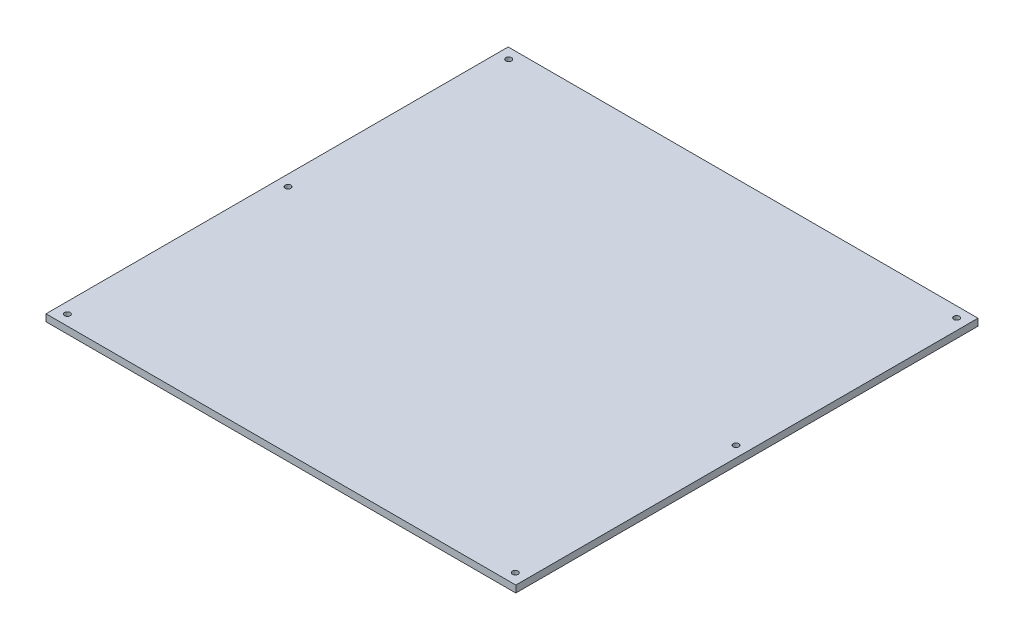
ISO-10303-21;
HEADER;
FILE_DESCRIPTION(('STEP AP214'),'2;1');
FILE_NAME('part.step','',(''),(''),'','','');
FILE_SCHEMA(('AUTOMOTIVE_DESIGN { 1 0 10303 214 1 1 1 1 }'));
ENDSEC;
DATA;
#1=APPLICATION_CONTEXT('core data for automotive mechanical design processes');
#2=APPLICATION_PROTOCOL_DEFINITION('international standard','automotive_design',2000,#1);
#3=PRODUCT_CONTEXT('',#1,'mechanical');
#4=PRODUCT('Part','Part','',(#3));
#5=PRODUCT_RELATED_PRODUCT_CATEGORY('part','',(#4));
#6=PRODUCT_DEFINITION_FORMATION('','',#4);
#7=PRODUCT_DEFINITION_CONTEXT('part definition',#1,'design');
#8=PRODUCT_DEFINITION('design','',#6,#7);
#9=PRODUCT_DEFINITION_SHAPE('','',#8);
#10=(LENGTH_UNIT() NAMED_UNIT(*) SI_UNIT(.MILLI.,.METRE.));
#11=(NAMED_UNIT(*) PLANE_ANGLE_UNIT() SI_UNIT($,.RADIAN.));
#12=(NAMED_UNIT(*) SI_UNIT($,.STERADIAN.) SOLID_ANGLE_UNIT());
#13=UNCERTAINTY_MEASURE_WITH_UNIT(LENGTH_MEASURE(1.E-05),#10,'distance_accuracy_value','');
#14=(GEOMETRIC_REPRESENTATION_CONTEXT(3) GLOBAL_UNCERTAINTY_ASSIGNED_CONTEXT((#13)) GLOBAL_UNIT_ASSIGNED_CONTEXT((#10,
#11,#12)) REPRESENTATION_CONTEXT('',''));
#15=CARTESIAN_POINT('',(0.,0.,0.));
#16=DIRECTION('',(0.,0.,1.));
#17=DIRECTION('',(1.,0.,0.));
#18=AXIS2_PLACEMENT_3D('',#15,#16,#17);
#19=CARTESIAN_POINT('',(0.,3.175,0.));
#20=DIRECTION('',(0.,-1.,0.));
#21=DIRECTION('',(0.,0.,-1.));
#22=AXIS2_PLACEMENT_3D('',#19,#20,#21);
#23=PLANE('',#22);
#24=CARTESIAN_POINT('',(-204.63,3.175,0.));
#25=DIRECTION('',(0.,1.,0.));
#26=DIRECTION('',(0.,0.,1.));
#27=AXIS2_PLACEMENT_3D('',#24,#25,#26);
#28=CIRCLE('',#27,2.59999999999999);
#29=CARTESIAN_POINT('',(-204.63,3.175,2.59999999999999));
#30=VERTEX_POINT('',#29);
#31=EDGE_CURVE('E132',#30,#30,#28,.T.);
#32=ORIENTED_EDGE('',*,*,#31,.F.);
#33=EDGE_LOOP('',(#32));
#34=FACE_BOUND('',#33,.T.);
#35=CARTESIAN_POINT('',(204.63,3.175,201.6125));
#36=DIRECTION('',(0.,1.,0.));
#37=DIRECTION('',(0.,0.,1.));
#38=AXIS2_PLACEMENT_3D('',#35,#36,#37);
#39=CIRCLE('',#38,2.59999999999999);
#40=CARTESIAN_POINT('',(204.63,3.175,204.2125));
#41=VERTEX_POINT('',#40);
#42=EDGE_CURVE('E120',#41,#41,#39,.T.);
#43=ORIENTED_EDGE('',*,*,#42,.F.);
#44=EDGE_LOOP('',(#43));
#45=FACE_BOUND('',#44,.T.);
#46=CARTESIAN_POINT('',(-204.63,3.175,-201.6125));
#47=DIRECTION('',(0.,1.,0.));
#48=DIRECTION('',(0.,0.,1.));
#49=AXIS2_PLACEMENT_3D('',#46,#47,#48);
#50=CIRCLE('',#49,2.59999999999999);
#51=CARTESIAN_POINT('',(-204.63,3.175,-199.0125));
#52=VERTEX_POINT('',#51);
#53=EDGE_CURVE('E99',#52,#52,#50,.T.);
#54=ORIENTED_EDGE('',*,*,#53,.F.);
#55=EDGE_LOOP('',(#54));
#56=FACE_BOUND('',#55,.T.);
#57=DIRECTION('',(0.,0.,1.));
#58=VECTOR('',#57,1.);
#59=CARTESIAN_POINT('',(-214.63,3.175,211.1375));
#60=LINE('',#59,#58);
#61=CARTESIAN_POINT('',(-214.63,3.175,-211.1375));
#62=VERTEX_POINT('',#61);
#63=CARTESIAN_POINT('',(-214.63,3.175,211.1375));
#64=VERTEX_POINT('',#63);
#65=EDGE_CURVE('E84',#62,#64,#60,.T.);
#66=ORIENTED_EDGE('',*,*,#65,.T.);
#67=DIRECTION('',(1.,0.,0.));
#68=VECTOR('',#67,1.);
#69=CARTESIAN_POINT('',(-214.63,3.175,211.1375));
#70=LINE('',#69,#68);
#71=CARTESIAN_POINT('',(214.63,3.175,211.1375));
#72=VERTEX_POINT('',#71);
#73=EDGE_CURVE('E79',#64,#72,#70,.T.);
#74=ORIENTED_EDGE('',*,*,#73,.T.);
#75=DIRECTION('',(0.,0.,-1.));
#76=VECTOR('',#75,1.);
#77=CARTESIAN_POINT('',(214.63,3.175,211.1375));
#78=LINE('',#77,#76);
#79=CARTESIAN_POINT('',(214.63,3.175,-211.1375));
#80=VERTEX_POINT('',#79);
#81=EDGE_CURVE('E82',#72,#80,#78,.T.);
#82=ORIENTED_EDGE('',*,*,#81,.T.);
#83=DIRECTION('',(-1.,0.,0.));
#84=VECTOR('',#83,1.);
#85=CARTESIAN_POINT('',(-214.63,3.175,-211.1375));
#86=LINE('',#85,#84);
#87=EDGE_CURVE('E49',#80,#62,#86,.T.);
#88=ORIENTED_EDGE('',*,*,#87,.T.);
#89=EDGE_LOOP('',(#66,#74,#82,#88));
#90=FACE_BOUND('',#89,.T.);
#91=CARTESIAN_POINT('',(204.63,3.175,-201.6125));
#92=DIRECTION('',(0.,1.,0.));
#93=DIRECTION('',(0.,0.,1.));
#94=AXIS2_PLACEMENT_3D('',#91,#92,#93);
#95=CIRCLE('',#94,2.59999999999999);
#96=CARTESIAN_POINT('',(204.63,3.175,-199.0125));
#97=VERTEX_POINT('',#96);
#98=EDGE_CURVE('E114',#97,#97,#95,.T.);
#99=ORIENTED_EDGE('',*,*,#98,.F.);
#100=EDGE_LOOP('',(#99));
#101=FACE_BOUND('',#100,.T.);
#102=CARTESIAN_POINT('',(-204.63,3.175,201.6125));
#103=DIRECTION('',(0.,1.,0.));
#104=DIRECTION('',(0.,0.,1.));
#105=AXIS2_PLACEMENT_3D('',#102,#103,#104);
#106=CIRCLE('',#105,2.59999999999999);
#107=CARTESIAN_POINT('',(-204.63,3.175,204.2125));
#108=VERTEX_POINT('',#107);
#109=EDGE_CURVE('E126',#108,#108,#106,.T.);
#110=ORIENTED_EDGE('',*,*,#109,.F.);
#111=EDGE_LOOP('',(#110));
#112=FACE_BOUND('',#111,.T.);
#113=CARTESIAN_POINT('',(204.63,3.175,0.));
#114=DIRECTION('',(0.,1.,0.));
#115=DIRECTION('',(0.,0.,1.));
#116=AXIS2_PLACEMENT_3D('',#113,#114,#115);
#117=CIRCLE('',#116,2.59999999999999);
#118=CARTESIAN_POINT('',(204.63,3.175,2.59999999999999));
#119=VERTEX_POINT('',#118);
#120=EDGE_CURVE('E138',#119,#119,#117,.T.);
#121=ORIENTED_EDGE('',*,*,#120,.F.);
#122=EDGE_LOOP('',(#121));
#123=FACE_BOUND('',#122,.T.);
#124=ADVANCED_FACE('F32',(#34,#45,#56,#90,#101,#112,#123),#23,.F.);
#125=CARTESIAN_POINT('',(0.,-3.175,0.));
#126=DIRECTION('',(0.,-1.,0.));
#127=DIRECTION('',(0.,0.,-1.));
#128=AXIS2_PLACEMENT_3D('',#125,#126,#127);
#129=PLANE('',#128);
#130=CARTESIAN_POINT('',(-204.63,-3.175,0.));
#131=DIRECTION('',(0.,1.,0.));
#132=DIRECTION('',(0.,0.,1.));
#133=AXIS2_PLACEMENT_3D('',#130,#131,#132);
#134=CIRCLE('',#133,2.59999999999999);
#135=CARTESIAN_POINT('',(-204.63,-3.175,2.59999999999999));
#136=VERTEX_POINT('',#135);
#137=EDGE_CURVE('E135',#136,#136,#134,.T.);
#138=ORIENTED_EDGE('',*,*,#137,.T.);
#139=EDGE_LOOP('',(#138));
#140=FACE_BOUND('',#139,.T.);
#141=CARTESIAN_POINT('',(204.63,-3.175,201.6125));
#142=DIRECTION('',(0.,1.,0.));
#143=DIRECTION('',(0.,0.,1.));
#144=AXIS2_PLACEMENT_3D('',#141,#142,#143);
#145=CIRCLE('',#144,2.59999999999999);
#146=CARTESIAN_POINT('',(204.63,-3.175,204.2125));
#147=VERTEX_POINT('',#146);
#148=EDGE_CURVE('E123',#147,#147,#145,.T.);
#149=ORIENTED_EDGE('',*,*,#148,.T.);
#150=EDGE_LOOP('',(#149));
#151=FACE_BOUND('',#150,.T.);
#152=CARTESIAN_POINT('',(-204.63,-3.175,-201.6125));
#153=DIRECTION('',(0.,1.,0.));
#154=DIRECTION('',(0.,0.,1.));
#155=AXIS2_PLACEMENT_3D('',#152,#153,#154);
#156=CIRCLE('',#155,2.59999999999999);
#157=CARTESIAN_POINT('',(-204.63,-3.175,-199.0125));
#158=VERTEX_POINT('',#157);
#159=EDGE_CURVE('E111',#158,#158,#156,.T.);
#160=ORIENTED_EDGE('',*,*,#159,.T.);
#161=EDGE_LOOP('',(#160));
#162=FACE_BOUND('',#161,.T.);
#163=DIRECTION('',(0.,0.,1.));
#164=VECTOR('',#163,1.);
#165=CARTESIAN_POINT('',(-214.63,-3.175,211.1375));
#166=LINE('',#165,#164);
#167=CARTESIAN_POINT('',(-214.63,-3.175,-211.1375));
#168=VERTEX_POINT('',#167);
#169=CARTESIAN_POINT('',(-214.63,-3.175,211.1375));
#170=VERTEX_POINT('',#169);
#171=EDGE_CURVE('E96',#168,#170,#166,.T.);
#172=ORIENTED_EDGE('',*,*,#171,.F.);
#173=DIRECTION('',(-1.,0.,0.));
#174=VECTOR('',#173,1.);
#175=CARTESIAN_POINT('',(-214.63,-3.175,-211.1375));
#176=LINE('',#175,#174);
#177=CARTESIAN_POINT('',(214.63,-3.175,-211.1375));
#178=VERTEX_POINT('',#177);
#179=EDGE_CURVE('E72',#178,#168,#176,.T.);
#180=ORIENTED_EDGE('',*,*,#179,.F.);
#181=DIRECTION('',(0.,0.,-1.));
#182=VECTOR('',#181,1.);
#183=CARTESIAN_POINT('',(214.63,-3.175,211.1375));
#184=LINE('',#183,#182);
#185=CARTESIAN_POINT('',(214.63,-3.175,211.1375));
#186=VERTEX_POINT('',#185);
#187=EDGE_CURVE('E66',#186,#178,#184,.T.);
#188=ORIENTED_EDGE('',*,*,#187,.F.);
#189=DIRECTION('',(1.,0.,0.));
#190=VECTOR('',#189,1.);
#191=CARTESIAN_POINT('',(-214.63,-3.175,211.1375));
#192=LINE('',#191,#190);
#193=EDGE_CURVE('E88',#170,#186,#192,.T.);
#194=ORIENTED_EDGE('',*,*,#193,.F.);
#195=EDGE_LOOP('',(#172,#180,#188,#194));
#196=FACE_BOUND('',#195,.T.);
#197=CARTESIAN_POINT('',(204.63,-3.175,-201.6125));
#198=DIRECTION('',(0.,1.,0.));
#199=DIRECTION('',(0.,0.,1.));
#200=AXIS2_PLACEMENT_3D('',#197,#198,#199);
#201=CIRCLE('',#200,2.59999999999999);
#202=CARTESIAN_POINT('',(204.63,-3.175,-199.0125));
#203=VERTEX_POINT('',#202);
#204=EDGE_CURVE('E117',#203,#203,#201,.T.);
#205=ORIENTED_EDGE('',*,*,#204,.T.);
#206=EDGE_LOOP('',(#205));
#207=FACE_BOUND('',#206,.T.);
#208=CARTESIAN_POINT('',(-204.63,-3.175,201.6125));
#209=DIRECTION('',(0.,1.,0.));
#210=DIRECTION('',(0.,0.,1.));
#211=AXIS2_PLACEMENT_3D('',#208,#209,#210);
#212=CIRCLE('',#211,2.59999999999999);
#213=CARTESIAN_POINT('',(-204.63,-3.175,204.2125));
#214=VERTEX_POINT('',#213);
#215=EDGE_CURVE('E129',#214,#214,#212,.T.);
#216=ORIENTED_EDGE('',*,*,#215,.T.);
#217=EDGE_LOOP('',(#216));
#218=FACE_BOUND('',#217,.T.);
#219=CARTESIAN_POINT('',(204.63,-3.175,0.));
#220=DIRECTION('',(0.,1.,0.));
#221=DIRECTION('',(0.,0.,1.));
#222=AXIS2_PLACEMENT_3D('',#219,#220,#221);
#223=CIRCLE('',#222,2.59999999999999);
#224=CARTESIAN_POINT('',(204.63,-3.175,2.59999999999999));
#225=VERTEX_POINT('',#224);
#226=EDGE_CURVE('E141',#225,#225,#223,.T.);
#227=ORIENTED_EDGE('',*,*,#226,.T.);
#228=EDGE_LOOP('',(#227));
#229=FACE_BOUND('',#228,.T.);
#230=ADVANCED_FACE('F107',(#140,#151,#162,#196,#207,#218,#229),#129,.T.);
#231=CARTESIAN_POINT('',(-214.63,3.175,211.1375));
#232=DIRECTION('',(1.,0.,0.));
#233=DIRECTION('',(0.,0.,-1.));
#234=AXIS2_PLACEMENT_3D('',#231,#232,#233);
#235=PLANE('',#234);
#236=ORIENTED_EDGE('',*,*,#171,.T.);
#237=DIRECTION('',(0.,-1.,0.));
#238=VECTOR('',#237,1.);
#239=CARTESIAN_POINT('',(-214.63,3.175,211.1375));
#240=LINE('',#239,#238);
#241=EDGE_CURVE('E11',#64,#170,#240,.T.);
#242=ORIENTED_EDGE('',*,*,#241,.F.);
#243=ORIENTED_EDGE('',*,*,#65,.F.);
#244=DIRECTION('',(0.,-1.,0.));
#245=VECTOR('',#244,1.);
#246=CARTESIAN_POINT('',(-214.63,3.175,-211.1375));
#247=LINE('',#246,#245);
#248=EDGE_CURVE('E92',#62,#168,#247,.T.);
#249=ORIENTED_EDGE('',*,*,#248,.T.);
#250=EDGE_LOOP('',(#236,#242,#243,#249));
#251=FACE_BOUND('',#250,.T.);
#252=ADVANCED_FACE('F34',(#251),#235,.F.);
#253=CARTESIAN_POINT('',(-214.63,3.175,211.1375));
#254=DIRECTION('',(0.,0.,-1.));
#255=DIRECTION('',(-1.,0.,0.));
#256=AXIS2_PLACEMENT_3D('',#253,#254,#255);
#257=PLANE('',#256);
#258=ORIENTED_EDGE('',*,*,#193,.T.);
#259=DIRECTION('',(0.,-1.,0.));
#260=VECTOR('',#259,1.);
#261=CARTESIAN_POINT('',(214.63,3.175,211.1375));
#262=LINE('',#261,#260);
#263=EDGE_CURVE('E41',#72,#186,#262,.T.);
#264=ORIENTED_EDGE('',*,*,#263,.F.);
#265=ORIENTED_EDGE('',*,*,#73,.F.);
#266=ORIENTED_EDGE('',*,*,#241,.T.);
#267=EDGE_LOOP('',(#258,#264,#265,#266));
#268=FACE_BOUND('',#267,.T.);
#269=ADVANCED_FACE('F87',(#268),#257,.F.);
#270=CARTESIAN_POINT('',(214.63,3.175,211.1375));
#271=DIRECTION('',(-1.,0.,0.));
#272=DIRECTION('',(0.,0.,1.));
#273=AXIS2_PLACEMENT_3D('',#270,#271,#272);
#274=PLANE('',#273);
#275=ORIENTED_EDGE('',*,*,#187,.T.);
#276=DIRECTION('',(0.,-1.,0.));
#277=VECTOR('',#276,1.);
#278=CARTESIAN_POINT('',(214.63,3.175,-211.1375));
#279=LINE('',#278,#277);
#280=EDGE_CURVE('E89',#80,#178,#279,.T.);
#281=ORIENTED_EDGE('',*,*,#280,.F.);
#282=ORIENTED_EDGE('',*,*,#81,.F.);
#283=ORIENTED_EDGE('',*,*,#263,.T.);
#284=EDGE_LOOP('',(#275,#281,#282,#283));
#285=FACE_BOUND('',#284,.T.);
#286=ADVANCED_FACE('F90',(#285),#274,.F.);
#287=CARTESIAN_POINT('',(-214.63,3.175,-211.1375));
#288=DIRECTION('',(0.,0.,1.));
#289=DIRECTION('',(1.,0.,0.));
#290=AXIS2_PLACEMENT_3D('',#287,#288,#289);
#291=PLANE('',#290);
#292=ORIENTED_EDGE('',*,*,#179,.T.);
#293=ORIENTED_EDGE('',*,*,#248,.F.);
#294=ORIENTED_EDGE('',*,*,#87,.F.);
#295=ORIENTED_EDGE('',*,*,#280,.T.);
#296=EDGE_LOOP('',(#292,#293,#294,#295));
#297=FACE_BOUND('',#296,.T.);
#298=ADVANCED_FACE('F104',(#297),#291,.F.);
#299=CARTESIAN_POINT('',(-204.63,3.175,-201.6125));
#300=DIRECTION('',(0.,-1.,0.));
#301=DIRECTION('',(0.,0.,-1.));
#302=AXIS2_PLACEMENT_3D('',#299,#300,#301);
#303=CYLINDRICAL_SURFACE('',#302,2.59999999999999);
#304=ORIENTED_EDGE('',*,*,#53,.T.);
#305=EDGE_LOOP('',(#304));
#306=FACE_BOUND('',#305,.T.);
#307=ORIENTED_EDGE('',*,*,#159,.F.);
#308=EDGE_LOOP('',(#307));
#309=FACE_BOUND('',#308,.T.);
#310=ADVANCED_FACE('F161',(#306,#309),#303,.F.);
#311=CARTESIAN_POINT('',(204.63,3.175,-201.6125));
#312=DIRECTION('',(0.,-1.,0.));
#313=DIRECTION('',(0.,0.,-1.));
#314=AXIS2_PLACEMENT_3D('',#311,#312,#313);
#315=CYLINDRICAL_SURFACE('',#314,2.59999999999999);
#316=ORIENTED_EDGE('',*,*,#98,.T.);
#317=EDGE_LOOP('',(#316));
#318=FACE_BOUND('',#317,.T.);
#319=ORIENTED_EDGE('',*,*,#204,.F.);
#320=EDGE_LOOP('',(#319));
#321=FACE_BOUND('',#320,.T.);
#322=ADVANCED_FACE('F207',(#318,#321),#315,.F.);
#323=CARTESIAN_POINT('',(204.63,3.175,201.6125));
#324=DIRECTION('',(0.,-1.,0.));
#325=DIRECTION('',(0.,0.,-1.));
#326=AXIS2_PLACEMENT_3D('',#323,#324,#325);
#327=CYLINDRICAL_SURFACE('',#326,2.59999999999999);
#328=ORIENTED_EDGE('',*,*,#42,.T.);
#329=EDGE_LOOP('',(#328));
#330=FACE_BOUND('',#329,.T.);
#331=ORIENTED_EDGE('',*,*,#148,.F.);
#332=EDGE_LOOP('',(#331));
#333=FACE_BOUND('',#332,.T.);
#334=ADVANCED_FACE('F215',(#330,#333),#327,.F.);
#335=CARTESIAN_POINT('',(-204.63,3.175,201.6125));
#336=DIRECTION('',(0.,-1.,0.));
#337=DIRECTION('',(0.,0.,-1.));
#338=AXIS2_PLACEMENT_3D('',#335,#336,#337);
#339=CYLINDRICAL_SURFACE('',#338,2.59999999999999);
#340=ORIENTED_EDGE('',*,*,#109,.T.);
#341=EDGE_LOOP('',(#340));
#342=FACE_BOUND('',#341,.T.);
#343=ORIENTED_EDGE('',*,*,#215,.F.);
#344=EDGE_LOOP('',(#343));
#345=FACE_BOUND('',#344,.T.);
#346=ADVANCED_FACE('F223',(#342,#345),#339,.F.);
#347=CARTESIAN_POINT('',(-204.63,3.175,0.));
#348=DIRECTION('',(0.,-1.,0.));
#349=DIRECTION('',(0.,0.,-1.));
#350=AXIS2_PLACEMENT_3D('',#347,#348,#349);
#351=CYLINDRICAL_SURFACE('',#350,2.59999999999999);
#352=ORIENTED_EDGE('',*,*,#31,.T.);
#353=EDGE_LOOP('',(#352));
#354=FACE_BOUND('',#353,.T.);
#355=ORIENTED_EDGE('',*,*,#137,.F.);
#356=EDGE_LOOP('',(#355));
#357=FACE_BOUND('',#356,.T.);
#358=ADVANCED_FACE('F232',(#354,#357),#351,.F.);
#359=CARTESIAN_POINT('',(204.63,3.175,0.));
#360=DIRECTION('',(0.,-1.,0.));
#361=DIRECTION('',(0.,0.,-1.));
#362=AXIS2_PLACEMENT_3D('',#359,#360,#361);
#363=CYLINDRICAL_SURFACE('',#362,2.59999999999999);
#364=ORIENTED_EDGE('',*,*,#120,.T.);
#365=EDGE_LOOP('',(#364));
#366=FACE_BOUND('',#365,.T.);
#367=ORIENTED_EDGE('',*,*,#226,.F.);
#368=EDGE_LOOP('',(#367));
#369=FACE_BOUND('',#368,.T.);
#370=ADVANCED_FACE('F147',(#366,#369),#363,.F.);
#371=CLOSED_SHELL('',(#124,#230,#252,#269,#286,#298,#310,#322,#334,#346,#358,#370));
#372=MANIFOLD_SOLID_BREP('B2',#371);
#373=ADVANCED_BREP_SHAPE_REPRESENTATION('',(#18,#372),#14);
#374=SHAPE_DEFINITION_REPRESENTATION(#9,#373);
ENDSEC;
END-ISO-10303-21;
